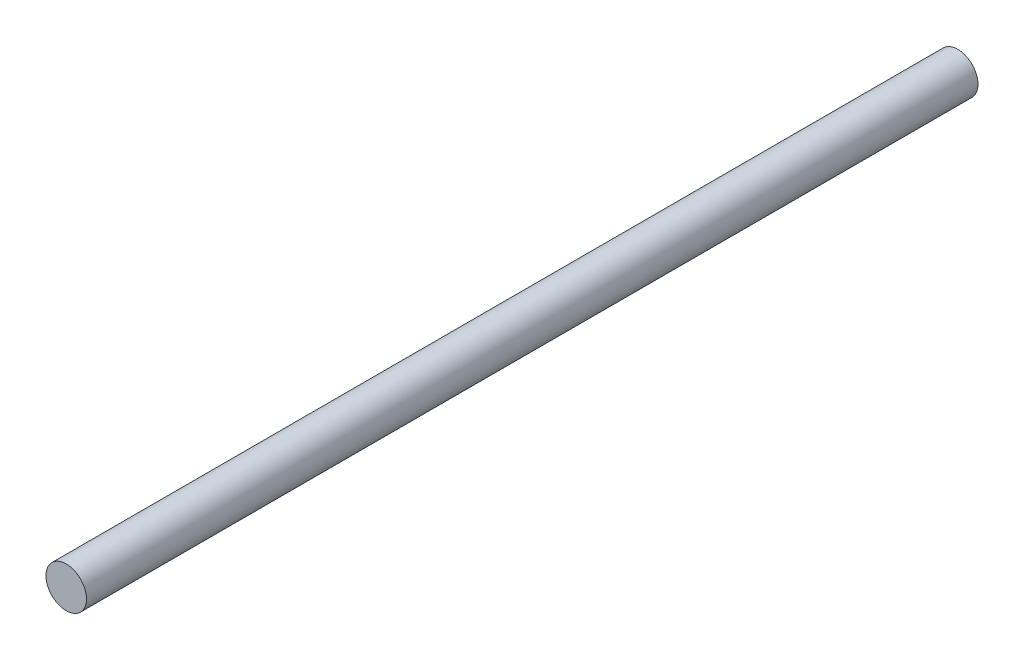
ISO-10303-21;
HEADER;
FILE_DESCRIPTION(('STEP AP214'),'2;1');
FILE_NAME('part.step','',(''),(''),'','','');
FILE_SCHEMA(('AUTOMOTIVE_DESIGN { 1 0 10303 214 1 1 1 1 }'));
ENDSEC;
DATA;
#1=APPLICATION_CONTEXT('core data for automotive mechanical design processes');
#2=APPLICATION_PROTOCOL_DEFINITION('international standard','automotive_design',2000,#1);
#3=PRODUCT_CONTEXT('',#1,'mechanical');
#4=PRODUCT('Part','Part','',(#3));
#5=PRODUCT_RELATED_PRODUCT_CATEGORY('part','',(#4));
#6=PRODUCT_DEFINITION_FORMATION('','',#4);
#7=PRODUCT_DEFINITION_CONTEXT('part definition',#1,'design');
#8=PRODUCT_DEFINITION('design','',#6,#7);
#9=PRODUCT_DEFINITION_SHAPE('','',#8);
#10=(LENGTH_UNIT() NAMED_UNIT(*) SI_UNIT(.MILLI.,.METRE.));
#11=(NAMED_UNIT(*) PLANE_ANGLE_UNIT() SI_UNIT($,.RADIAN.));
#12=(NAMED_UNIT(*) SI_UNIT($,.STERADIAN.) SOLID_ANGLE_UNIT());
#13=UNCERTAINTY_MEASURE_WITH_UNIT(LENGTH_MEASURE(1.E-05),#10,'distance_accuracy_value','');
#14=(GEOMETRIC_REPRESENTATION_CONTEXT(3) GLOBAL_UNCERTAINTY_ASSIGNED_CONTEXT((#13)) GLOBAL_UNIT_ASSIGNED_CONTEXT((#10,
#11,#12)) REPRESENTATION_CONTEXT('',''));
#15=CARTESIAN_POINT('',(0.,0.,0.));
#16=DIRECTION('',(0.,0.,1.));
#17=DIRECTION('',(1.,0.,0.));
#18=AXIS2_PLACEMENT_3D('',#15,#16,#17);
#19=CARTESIAN_POINT('',(0.,0.,33.));
#20=DIRECTION('',(0.,0.,-1.));
#21=DIRECTION('',(-1.,0.,0.));
#22=AXIS2_PLACEMENT_3D('',#19,#20,#21);
#23=CYLINDRICAL_SURFACE('',#22,0.75);
#24=CARTESIAN_POINT('',(0.,0.,33.));
#25=DIRECTION('',(0.,0.,1.));
#26=DIRECTION('',(1.,0.,0.));
#27=AXIS2_PLACEMENT_3D('',#24,#25,#26);
#28=CIRCLE('',#27,0.75);
#29=CARTESIAN_POINT('',(0.75,0.,33.));
#30=VERTEX_POINT('',#29);
#31=EDGE_CURVE('E10',#30,#30,#28,.T.);
#32=ORIENTED_EDGE('',*,*,#31,.F.);
#33=EDGE_LOOP('',(#32));
#34=FACE_BOUND('',#33,.T.);
#35=CARTESIAN_POINT('',(0.,0.,0.));
#36=DIRECTION('',(0.,0.,1.));
#37=DIRECTION('',(1.,0.,0.));
#38=AXIS2_PLACEMENT_3D('',#35,#36,#37);
#39=CIRCLE('',#38,0.75);
#40=CARTESIAN_POINT('',(0.75,0.,0.));
#41=VERTEX_POINT('',#40);
#42=EDGE_CURVE('E37',#41,#41,#39,.T.);
#43=ORIENTED_EDGE('',*,*,#42,.T.);
#44=EDGE_LOOP('',(#43));
#45=FACE_BOUND('',#44,.T.);
#46=ADVANCED_FACE('F34',(#34,#45),#23,.T.);
#47=CARTESIAN_POINT('',(0.,0.,33.));
#48=DIRECTION('',(0.,0.,1.));
#49=DIRECTION('',(1.,0.,0.));
#50=AXIS2_PLACEMENT_3D('',#47,#48,#49);
#51=PLANE('',#50);
#52=ORIENTED_EDGE('',*,*,#31,.T.);
#53=EDGE_LOOP('',(#52));
#54=FACE_BOUND('',#53,.T.);
#55=ADVANCED_FACE('F49',(#54),#51,.T.);
#56=CARTESIAN_POINT('',(0.,0.,0.));
#57=DIRECTION('',(0.,0.,1.));
#58=DIRECTION('',(1.,0.,0.));
#59=AXIS2_PLACEMENT_3D('',#56,#57,#58);
#60=PLANE('',#59);
#61=ORIENTED_EDGE('',*,*,#42,.F.);
#62=EDGE_LOOP('',(#61));
#63=FACE_BOUND('',#62,.T.);
#64=ADVANCED_FACE('F47',(#63),#60,.F.);
#65=CLOSED_SHELL('',(#46,#55,#64));
#66=MANIFOLD_SOLID_BREP('B2',#65);
#67=ADVANCED_BREP_SHAPE_REPRESENTATION('',(#18,#66),#14);
#68=SHAPE_DEFINITION_REPRESENTATION(#9,#67);
ENDSEC;
END-ISO-10303-21;
